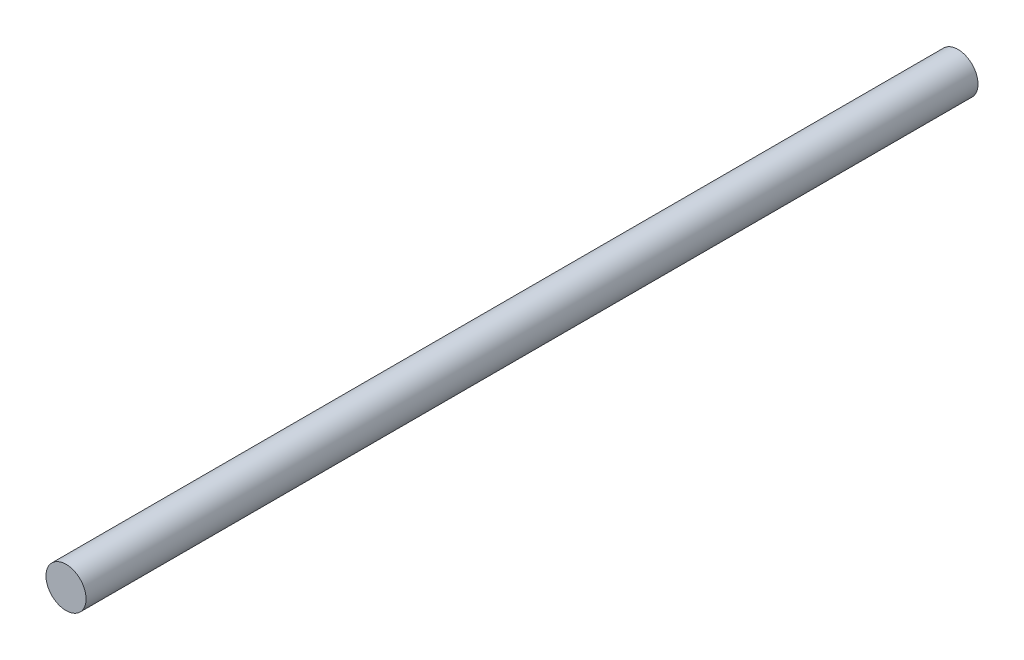
ISO-10303-21;
HEADER;
FILE_DESCRIPTION(('STEP AP214'),'2;1');
FILE_NAME('part.step','',(''),(''),'','','');
FILE_SCHEMA(('AUTOMOTIVE_DESIGN { 1 0 10303 214 1 1 1 1 }'));
ENDSEC;
DATA;
#1=APPLICATION_CONTEXT('core data for automotive mechanical design processes');
#2=APPLICATION_PROTOCOL_DEFINITION('international standard','automotive_design',2000,#1);
#3=PRODUCT_CONTEXT('',#1,'mechanical');
#4=PRODUCT('Part','Part','',(#3));
#5=PRODUCT_RELATED_PRODUCT_CATEGORY('part','',(#4));
#6=PRODUCT_DEFINITION_FORMATION('','',#4);
#7=PRODUCT_DEFINITION_CONTEXT('part definition',#1,'design');
#8=PRODUCT_DEFINITION('design','',#6,#7);
#9=PRODUCT_DEFINITION_SHAPE('','',#8);
#10=(LENGTH_UNIT() NAMED_UNIT(*) SI_UNIT(.MILLI.,.METRE.));
#11=(NAMED_UNIT(*) PLANE_ANGLE_UNIT() SI_UNIT($,.RADIAN.));
#12=(NAMED_UNIT(*) SI_UNIT($,.STERADIAN.) SOLID_ANGLE_UNIT());
#13=UNCERTAINTY_MEASURE_WITH_UNIT(LENGTH_MEASURE(1.E-05),#10,'distance_accuracy_value','');
#14=(GEOMETRIC_REPRESENTATION_CONTEXT(3) GLOBAL_UNCERTAINTY_ASSIGNED_CONTEXT((#13)) GLOBAL_UNIT_ASSIGNED_CONTEXT((#10,
#11,#12)) REPRESENTATION_CONTEXT('',''));
#15=CARTESIAN_POINT('',(0.,0.,0.));
#16=DIRECTION('',(0.,0.,1.));
#17=DIRECTION('',(1.,0.,0.));
#18=AXIS2_PLACEMENT_3D('',#15,#16,#17);
#19=CARTESIAN_POINT('',(0.,0.,100.));
#20=DIRECTION('',(0.,0.,-1.));
#21=DIRECTION('',(-1.,0.,0.));
#22=AXIS2_PLACEMENT_3D('',#19,#20,#21);
#23=CYLINDRICAL_SURFACE('',#22,2.25);
#24=CARTESIAN_POINT('',(0.,0.,100.));
#25=DIRECTION('',(0.,0.,1.));
#26=DIRECTION('',(1.,0.,0.));
#27=AXIS2_PLACEMENT_3D('',#24,#25,#26);
#28=CIRCLE('',#27,2.25);
#29=CARTESIAN_POINT('',(2.25,0.,100.));
#30=VERTEX_POINT('',#29);
#31=EDGE_CURVE('E10',#30,#30,#28,.T.);
#32=ORIENTED_EDGE('',*,*,#31,.F.);
#33=EDGE_LOOP('',(#32));
#34=FACE_BOUND('',#33,.T.);
#35=CARTESIAN_POINT('',(0.,0.,0.));
#36=DIRECTION('',(0.,0.,1.));
#37=DIRECTION('',(1.,0.,0.));
#38=AXIS2_PLACEMENT_3D('',#35,#36,#37);
#39=CIRCLE('',#38,2.25);
#40=CARTESIAN_POINT('',(2.25,0.,0.));
#41=VERTEX_POINT('',#40);
#42=EDGE_CURVE('E37',#41,#41,#39,.T.);
#43=ORIENTED_EDGE('',*,*,#42,.T.);
#44=EDGE_LOOP('',(#43));
#45=FACE_BOUND('',#44,.T.);
#46=ADVANCED_FACE('F34',(#34,#45),#23,.T.);
#47=CARTESIAN_POINT('',(0.,0.,100.));
#48=DIRECTION('',(0.,0.,1.));
#49=DIRECTION('',(1.,0.,0.));
#50=AXIS2_PLACEMENT_3D('',#47,#48,#49);
#51=PLANE('',#50);
#52=ORIENTED_EDGE('',*,*,#31,.T.);
#53=EDGE_LOOP('',(#52));
#54=FACE_BOUND('',#53,.T.);
#55=ADVANCED_FACE('F49',(#54),#51,.T.);
#56=CARTESIAN_POINT('',(0.,0.,0.));
#57=DIRECTION('',(0.,0.,1.));
#58=DIRECTION('',(1.,0.,0.));
#59=AXIS2_PLACEMENT_3D('',#56,#57,#58);
#60=PLANE('',#59);
#61=ORIENTED_EDGE('',*,*,#42,.F.);
#62=EDGE_LOOP('',(#61));
#63=FACE_BOUND('',#62,.T.);
#64=ADVANCED_FACE('F47',(#63),#60,.F.);
#65=CLOSED_SHELL('',(#46,#55,#64));
#66=MANIFOLD_SOLID_BREP('B2',#65);
#67=ADVANCED_BREP_SHAPE_REPRESENTATION('',(#18,#66),#14);
#68=SHAPE_DEFINITION_REPRESENTATION(#9,#67);
ENDSEC;
END-ISO-10303-21;
